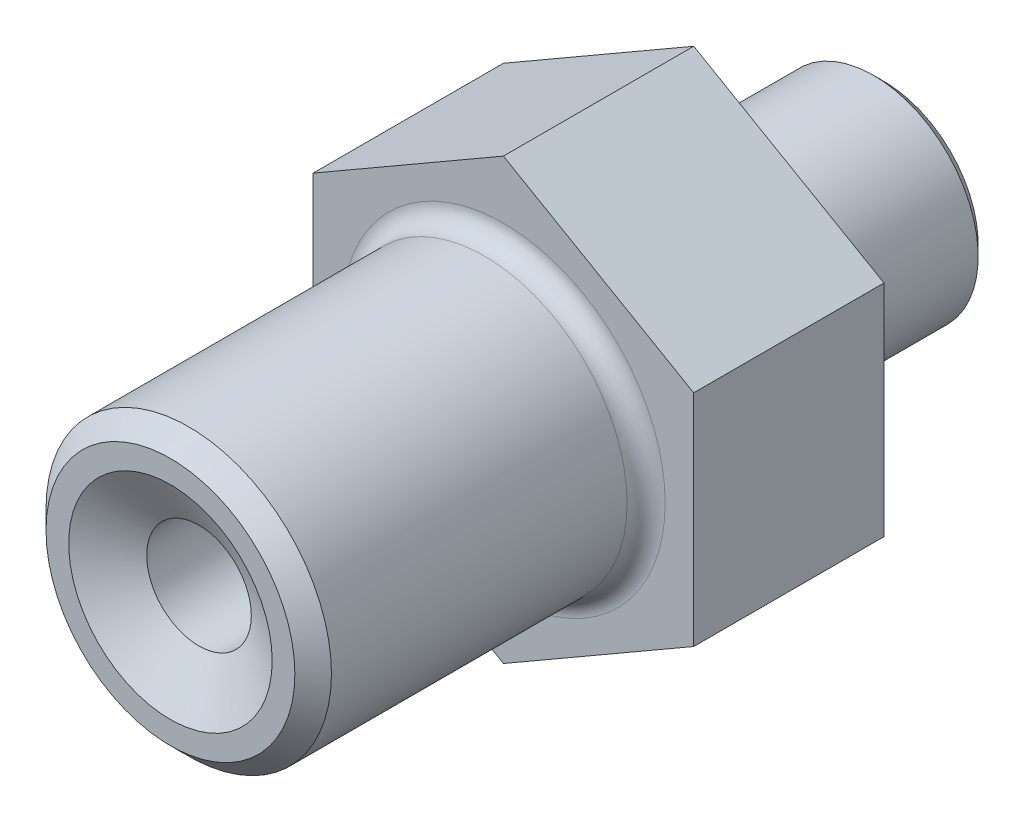
ISO-10303-21;
HEADER;
FILE_DESCRIPTION(('STEP AP214'),'2;1');
FILE_NAME('part.step','',(''),(''),'','','');
FILE_SCHEMA(('AUTOMOTIVE_DESIGN { 1 0 10303 214 1 1 1 1 }'));
ENDSEC;
DATA;
#1=APPLICATION_CONTEXT('core data for automotive mechanical design processes');
#2=APPLICATION_PROTOCOL_DEFINITION('international standard','automotive_design',2000,#1);
#3=PRODUCT_CONTEXT('',#1,'mechanical');
#4=PRODUCT('Part','Part','',(#3));
#5=PRODUCT_RELATED_PRODUCT_CATEGORY('part','',(#4));
#6=PRODUCT_DEFINITION_FORMATION('','',#4);
#7=PRODUCT_DEFINITION_CONTEXT('part definition',#1,'design');
#8=PRODUCT_DEFINITION('design','',#6,#7);
#9=PRODUCT_DEFINITION_SHAPE('','',#8);
#10=(LENGTH_UNIT() NAMED_UNIT(*) SI_UNIT(.MILLI.,.METRE.));
#11=(NAMED_UNIT(*) PLANE_ANGLE_UNIT() SI_UNIT($,.RADIAN.));
#12=(NAMED_UNIT(*) SI_UNIT($,.STERADIAN.) SOLID_ANGLE_UNIT());
#13=UNCERTAINTY_MEASURE_WITH_UNIT(LENGTH_MEASURE(1.E-05),#10,'distance_accuracy_value','');
#14=(GEOMETRIC_REPRESENTATION_CONTEXT(3) GLOBAL_UNCERTAINTY_ASSIGNED_CONTEXT((#13)) GLOBAL_UNIT_ASSIGNED_CONTEXT((#10,
#11,#12)) REPRESENTATION_CONTEXT('',''));
#15=CARTESIAN_POINT('',(0.,0.,0.));
#16=DIRECTION('',(0.,0.,1.));
#17=DIRECTION('',(1.,0.,0.));
#18=AXIS2_PLACEMENT_3D('',#15,#16,#17);
#19=CARTESIAN_POINT('',(0.,0.,55.));
#20=DIRECTION('',(0.,0.,1.));
#21=DIRECTION('',(1.00000000000002,0.,0.));
#22=AXIS2_PLACEMENT_3D('',#19,#20,#21);
#23=PLANE('',#22);
#24=CARTESIAN_POINT('',(0.,0.,55.));
#25=DIRECTION('',(0.,0.,1.));
#26=DIRECTION('',(1.00000000000002,0.,0.));
#27=AXIS2_PLACEMENT_3D('',#24,#25,#26);
#28=CIRCLE('',#27,13.079);
#29=CARTESIAN_POINT('',(13.0790000000002,0.,55.));
#30=VERTEX_POINT('',#29);
#31=EDGE_CURVE('E145',#30,#30,#28,.T.);
#32=ORIENTED_EDGE('',*,*,#31,.T.);
#33=EDGE_LOOP('',(#32));
#34=FACE_BOUND('',#33,.T.);
#35=CARTESIAN_POINT('',(0.,0.,55.));
#36=DIRECTION('',(0.,0.,1.));
#37=DIRECTION('',(1.00000000000002,0.,0.));
#38=AXIS2_PLACEMENT_3D('',#35,#36,#37);
#39=CIRCLE('',#38,10.6961524227067);
#40=CARTESIAN_POINT('',(10.6961524227068,0.,55.));
#41=VERTEX_POINT('',#40);
#42=EDGE_CURVE('E136',#41,#41,#39,.T.);
#43=ORIENTED_EDGE('',*,*,#42,.F.);
#44=EDGE_LOOP('',(#43));
#45=FACE_BOUND('',#44,.T.);
#46=ADVANCED_FACE('F38',(#34,#45),#23,.T.);
#47=CARTESIAN_POINT('',(0.,0.,-20.));
#48=DIRECTION('',(0.,0.,-1.));
#49=DIRECTION('',(-1.00000000000002,0.,0.));
#50=AXIS2_PLACEMENT_3D('',#47,#48,#49);
#51=PLANE('',#50);
#52=CARTESIAN_POINT('',(0.,0.,-20.));
#53=DIRECTION('',(0.,0.,-1.));
#54=DIRECTION('',(-1.00000000000002,0.,0.));
#55=AXIS2_PLACEMENT_3D('',#52,#53,#54);
#56=CIRCLE('',#55,6.65470053837926);
#57=CARTESIAN_POINT('',(-6.65470053837936,0.,-20.));
#58=VERTEX_POINT('',#57);
#59=EDGE_CURVE('E46',#58,#58,#56,.F.);
#60=ORIENTED_EDGE('',*,*,#59,.T.);
#61=EDGE_LOOP('',(#60));
#62=FACE_BOUND('',#61,.T.);
#63=CARTESIAN_POINT('',(0.,0.,-20.));
#64=DIRECTION('',(0.,0.,-1.));
#65=DIRECTION('',(-1.00000000000002,0.,0.));
#66=AXIS2_PLACEMENT_3D('',#63,#64,#65);
#67=CIRCLE('',#66,9.89849999999999);
#68=CARTESIAN_POINT('',(-9.89850000000014,0.,-20.));
#69=VERTEX_POINT('',#68);
#70=EDGE_CURVE('E139',#69,#69,#67,.T.);
#71=ORIENTED_EDGE('',*,*,#70,.T.);
#72=EDGE_LOOP('',(#71));
#73=FACE_BOUND('',#72,.T.);
#74=ADVANCED_FACE('F161',(#62,#73),#51,.T.);
#75=CARTESIAN_POINT('',(0.,0.,0.));
#76=DIRECTION('',(0.,0.,1.));
#77=DIRECTION('',(1.00000000000002,0.,0.));
#78=AXIS2_PLACEMENT_3D('',#75,#76,#77);
#79=PLANE('',#78);
#80=CARTESIAN_POINT('',(0.,0.,0.));
#81=DIRECTION('',(0.,0.,-1.));
#82=DIRECTION('',(-1.00000000000002,0.,0.));
#83=AXIS2_PLACEMENT_3D('',#80,#81,#82);
#84=CIRCLE('',#83,9.5);
#85=CARTESIAN_POINT('',(-9.50000000000014,0.,0.));
#86=VERTEX_POINT('',#85);
#87=EDGE_CURVE('E129',#86,#86,#84,.T.);
#88=ORIENTED_EDGE('',*,*,#87,.F.);
#89=EDGE_LOOP('',(#88));
#90=FACE_BOUND('',#89,.T.);
#91=DIRECTION('',(0.866025403784452,0.500000000000008,0.));
#92=VECTOR('',#91,1.);
#93=CARTESIAN_POINT('',(-20.0000000000003,11.5470053837927,0.));
#94=LINE('',#93,#92);
#95=CARTESIAN_POINT('',(-20.0000000000003,11.5470053837927,0.));
#96=VERTEX_POINT('',#95);
#97=CARTESIAN_POINT('',(0.,23.0940107675854,0.));
#98=VERTEX_POINT('',#97);
#99=EDGE_CURVE('E121',#96,#98,#94,.T.);
#100=ORIENTED_EDGE('',*,*,#99,.T.);
#101=DIRECTION('',(0.866025403784452,-0.500000000000008,0.));
#102=VECTOR('',#101,1.);
#103=CARTESIAN_POINT('',(0.,23.0940107675854,0.));
#104=LINE('',#103,#102);
#105=CARTESIAN_POINT('',(20.0000000000004,11.5470053837927,0.));
#106=VERTEX_POINT('',#105);
#107=EDGE_CURVE('E372',#98,#106,#104,.T.);
#108=ORIENTED_EDGE('',*,*,#107,.T.);
#109=DIRECTION('',(0.,-1.00000000000001,0.));
#110=VECTOR('',#109,1.);
#111=CARTESIAN_POINT('',(20.0000000000004,11.5470053837927,0.));
#112=LINE('',#111,#110);
#113=CARTESIAN_POINT('',(20.0000000000003,-11.5470053837926,0.));
#114=VERTEX_POINT('',#113);
#115=EDGE_CURVE('E386',#106,#114,#112,.T.);
#116=ORIENTED_EDGE('',*,*,#115,.T.);
#117=DIRECTION('',(-0.866025403784452,-0.500000000000007,0.));
#118=VECTOR('',#117,1.);
#119=CARTESIAN_POINT('',(20.0000000000003,-11.5470053837926,0.));
#120=LINE('',#119,#118);
#121=CARTESIAN_POINT('',(0.,-23.0940107675853,0.));
#122=VERTEX_POINT('',#121);
#123=EDGE_CURVE('E383',#114,#122,#120,.T.);
#124=ORIENTED_EDGE('',*,*,#123,.T.);
#125=DIRECTION('',(-0.866025403784452,0.500000000000008,0.));
#126=VECTOR('',#125,1.);
#127=CARTESIAN_POINT('',(0.,-23.0940107675853,0.));
#128=LINE('',#127,#126);
#129=CARTESIAN_POINT('',(-20.,-11.5470053837925,0.));
#130=VERTEX_POINT('',#129);
#131=EDGE_CURVE('E105',#122,#130,#128,.T.);
#132=ORIENTED_EDGE('',*,*,#131,.T.);
#133=DIRECTION('',(0.,1.00000000000001,0.));
#134=VECTOR('',#133,1.);
#135=CARTESIAN_POINT('',(-20.,-11.5470053837925,0.));
#136=LINE('',#135,#134);
#137=EDGE_CURVE('E132',#130,#96,#136,.T.);
#138=ORIENTED_EDGE('',*,*,#137,.T.);
#139=EDGE_LOOP('',(#100,#108,#116,#124,#132,#138));
#140=FACE_BOUND('',#139,.T.);
#141=ADVANCED_FACE('F184',(#90,#140),#79,.F.);
#142=CARTESIAN_POINT('',(0.,0.,20.));
#143=DIRECTION('',(0.,0.,1.));
#144=DIRECTION('',(1.00000000000002,0.,0.));
#145=AXIS2_PLACEMENT_3D('',#142,#143,#144);
#146=PLANE('',#145);
#147=CARTESIAN_POINT('',(0.,0.,20.));
#148=DIRECTION('',(0.,0.,1.));
#149=DIRECTION('',(1.00000000000002,0.,0.));
#150=AXIS2_PLACEMENT_3D('',#147,#148,#149);
#151=CIRCLE('',#150,17.);
#152=CARTESIAN_POINT('',(17.0000000000003,0.,20.));
#153=VERTEX_POINT('',#152);
#154=EDGE_CURVE('E156',#153,#153,#151,.F.);
#155=ORIENTED_EDGE('',*,*,#154,.T.);
#156=EDGE_LOOP('',(#155));
#157=FACE_BOUND('',#156,.T.);
#158=DIRECTION('',(0.866025403784452,0.500000000000008,0.));
#159=VECTOR('',#158,1.);
#160=CARTESIAN_POINT('',(-20.0000000000003,11.5470053837927,20.));
#161=LINE('',#160,#159);
#162=CARTESIAN_POINT('',(-20.0000000000003,11.5470053837927,20.));
#163=VERTEX_POINT('',#162);
#164=CARTESIAN_POINT('',(0.,23.0940107675853,20.));
#165=VERTEX_POINT('',#164);
#166=EDGE_CURVE('E124',#163,#165,#161,.T.);
#167=ORIENTED_EDGE('',*,*,#166,.F.);
#168=DIRECTION('',(0.,1.00000000000001,0.));
#169=VECTOR('',#168,1.);
#170=CARTESIAN_POINT('',(-20.0000000000003,-11.5470053837925,20.));
#171=LINE('',#170,#169);
#172=CARTESIAN_POINT('',(-20.0000000000003,-11.5470053837925,20.));
#173=VERTEX_POINT('',#172);
#174=EDGE_CURVE('E95',#173,#163,#171,.T.);
#175=ORIENTED_EDGE('',*,*,#174,.F.);
#176=DIRECTION('',(-0.866025403784452,0.500000000000007,0.));
#177=VECTOR('',#176,1.);
#178=CARTESIAN_POINT('',(0.,-23.0940107675853,20.));
#179=LINE('',#178,#177);
#180=CARTESIAN_POINT('',(0.,-23.0940107675853,20.));
#181=VERTEX_POINT('',#180);
#182=EDGE_CURVE('E88',#181,#173,#179,.T.);
#183=ORIENTED_EDGE('',*,*,#182,.F.);
#184=DIRECTION('',(-0.866025403784452,-0.500000000000007,0.));
#185=VECTOR('',#184,1.);
#186=CARTESIAN_POINT('',(20.0000000000003,-11.5470053837926,20.));
#187=LINE('',#186,#185);
#188=CARTESIAN_POINT('',(20.0000000000003,-11.5470053837926,20.));
#189=VERTEX_POINT('',#188);
#190=EDGE_CURVE('E92',#189,#181,#187,.T.);
#191=ORIENTED_EDGE('',*,*,#190,.F.);
#192=DIRECTION('',(0.,-1.00000000000001,0.));
#193=VECTOR('',#192,1.);
#194=CARTESIAN_POINT('',(20.0000000000003,11.5470053837927,20.));
#195=LINE('',#194,#193);
#196=CARTESIAN_POINT('',(20.0000000000003,11.5470053837927,20.));
#197=VERTEX_POINT('',#196);
#198=EDGE_CURVE('E59',#197,#189,#195,.T.);
#199=ORIENTED_EDGE('',*,*,#198,.F.);
#200=DIRECTION('',(0.866025403784452,-0.500000000000007,0.));
#201=VECTOR('',#200,1.);
#202=CARTESIAN_POINT('',(0.,23.0940107675853,20.));
#203=LINE('',#202,#201);
#204=EDGE_CURVE('E53',#165,#197,#203,.T.);
#205=ORIENTED_EDGE('',*,*,#204,.F.);
#206=EDGE_LOOP('',(#167,#175,#183,#191,#199,#205));
#207=FACE_BOUND('',#206,.T.);
#208=ADVANCED_FACE('F90',(#157,#207),#146,.T.);
#209=CARTESIAN_POINT('',(0.,0.,55.));
#210=DIRECTION('',(0.,0.,-1.));
#211=DIRECTION('',(-1.00000000000002,0.,0.));
#212=AXIS2_PLACEMENT_3D('',#209,#210,#211);
#213=CYLINDRICAL_SURFACE('',#212,15.);
#214=CARTESIAN_POINT('',(0.,0.,22.));
#215=DIRECTION('',(0.,0.,1.));
#216=DIRECTION('',(1.00000000000002,0.,0.));
#217=AXIS2_PLACEMENT_3D('',#214,#215,#216);
#218=CIRCLE('',#217,15.);
#219=CARTESIAN_POINT('',(15.0000000000002,0.,22.));
#220=VERTEX_POINT('',#219);
#221=EDGE_CURVE('E153',#220,#220,#218,.T.);
#222=ORIENTED_EDGE('',*,*,#221,.T.);
#223=EDGE_LOOP('',(#222));
#224=FACE_BOUND('',#223,.T.);
#225=CARTESIAN_POINT('',(0.,0.,53.079));
#226=DIRECTION('',(0.,0.,1.));
#227=DIRECTION('',(1.00000000000002,0.,0.));
#228=AXIS2_PLACEMENT_3D('',#225,#226,#227);
#229=CIRCLE('',#228,15.);
#230=CARTESIAN_POINT('',(15.0000000000002,0.,53.079));
#231=VERTEX_POINT('',#230);
#232=EDGE_CURVE('E150',#231,#231,#229,.F.);
#233=ORIENTED_EDGE('',*,*,#232,.T.);
#234=EDGE_LOOP('',(#233));
#235=FACE_BOUND('',#234,.T.);
#236=ADVANCED_FACE('F190',(#224,#235),#213,.T.);
#237=CARTESIAN_POINT('',(0.,0.,-20.));
#238=DIRECTION('',(0.,0.,1.));
#239=DIRECTION('',(1.00000000000002,0.,0.));
#240=AXIS2_PLACEMENT_3D('',#237,#238,#239);
#241=CYLINDRICAL_SURFACE('',#240,11.);
#242=CARTESIAN_POINT('',(0.,0.,-2.));
#243=DIRECTION('',(0.,0.,-1.));
#244=DIRECTION('',(-1.00000000000002,0.,0.));
#245=AXIS2_PLACEMENT_3D('',#242,#243,#244);
#246=CIRCLE('',#245,11.);
#247=CARTESIAN_POINT('',(-11.0000000000002,0.,-2.));
#248=VERTEX_POINT('',#247);
#249=EDGE_CURVE('E128',#248,#248,#246,.T.);
#250=ORIENTED_EDGE('',*,*,#249,.T.);
#251=EDGE_LOOP('',(#250));
#252=FACE_BOUND('',#251,.T.);
#253=CARTESIAN_POINT('',(0.,0.,-18.8985));
#254=DIRECTION('',(0.,0.,-1.));
#255=DIRECTION('',(-1.00000000000002,0.,0.));
#256=AXIS2_PLACEMENT_3D('',#253,#254,#255);
#257=CIRCLE('',#256,11.);
#258=CARTESIAN_POINT('',(-11.0000000000002,0.,-18.8985));
#259=VERTEX_POINT('',#258);
#260=EDGE_CURVE('E142',#259,#259,#257,.F.);
#261=ORIENTED_EDGE('',*,*,#260,.T.);
#262=EDGE_LOOP('',(#261));
#263=FACE_BOUND('',#262,.T.);
#264=ADVANCED_FACE('F189',(#252,#263),#241,.T.);
#265=CARTESIAN_POINT('',(0.,0.,52.));
#266=DIRECTION('',(0.,0.,1.));
#267=DIRECTION('',(1.00000000000002,0.,0.));
#268=AXIS2_PLACEMENT_3D('',#265,#266,#267);
#269=CONICAL_SURFACE('',#268,5.5,1.0471975511966);
#270=ORIENTED_EDGE('',*,*,#42,.T.);
#271=EDGE_LOOP('',(#270));
#272=FACE_BOUND('',#271,.T.);
#273=CARTESIAN_POINT('',(0.,0.,52.));
#274=DIRECTION('',(0.,0.,1.));
#275=DIRECTION('',(1.00000000000002,0.,0.));
#276=AXIS2_PLACEMENT_3D('',#273,#274,#275);
#277=CIRCLE('',#276,5.5);
#278=CARTESIAN_POINT('',(5.50000000000009,0.,52.));
#279=VERTEX_POINT('',#278);
#280=EDGE_CURVE('E133',#279,#279,#277,.T.);
#281=ORIENTED_EDGE('',*,*,#280,.F.);
#282=EDGE_LOOP('',(#281));
#283=FACE_BOUND('',#282,.T.);
#284=ADVANCED_FACE('F229',(#272,#283),#269,.F.);
#285=CARTESIAN_POINT('',(0.,0.,55.));
#286=DIRECTION('',(0.,0.,1.));
#287=DIRECTION('',(1.00000000000002,0.,0.));
#288=AXIS2_PLACEMENT_3D('',#285,#286,#287);
#289=CYLINDRICAL_SURFACE('',#288,5.5);
#290=CARTESIAN_POINT('',(0.,0.,-18.));
#291=DIRECTION('',(0.,0.,-1.));
#292=DIRECTION('',(-1.00000000000002,0.,0.));
#293=AXIS2_PLACEMENT_3D('',#290,#291,#292);
#294=CIRCLE('',#293,5.5);
#295=CARTESIAN_POINT('',(-5.50000000000008,0.,-18.));
#296=VERTEX_POINT('',#295);
#297=EDGE_CURVE('E11',#296,#296,#294,.T.);
#298=ORIENTED_EDGE('',*,*,#297,.T.);
#299=EDGE_LOOP('',(#298));
#300=FACE_BOUND('',#299,.T.);
#301=ORIENTED_EDGE('',*,*,#280,.T.);
#302=EDGE_LOOP('',(#301));
#303=FACE_BOUND('',#302,.T.);
#304=ADVANCED_FACE('F204',(#300,#303),#289,.F.);
#305=CARTESIAN_POINT('',(0.,0.,-20.));
#306=DIRECTION('',(0.,0.,1.));
#307=DIRECTION('',(1.00000000000002,0.,0.));
#308=AXIS2_PLACEMENT_3D('',#305,#306,#307);
#309=CONICAL_SURFACE('',#308,9.89849999999999,0.785398163397447);
#310=ORIENTED_EDGE('',*,*,#260,.F.);
#311=EDGE_LOOP('',(#310));
#312=FACE_BOUND('',#311,.T.);
#313=ORIENTED_EDGE('',*,*,#70,.F.);
#314=EDGE_LOOP('',(#313));
#315=FACE_BOUND('',#314,.T.);
#316=ADVANCED_FACE('F200',(#312,#315),#309,.T.);
#317=CARTESIAN_POINT('',(0.,0.,-2.));
#318=DIRECTION('',(0.,0.,-1.));
#319=DIRECTION('',(-1.00000000000002,0.,0.));
#320=AXIS2_PLACEMENT_3D('',#317,#318,#319);
#321=PLANE('',#320);
#322=CARTESIAN_POINT('',(0.,0.,-2.));
#323=DIRECTION('',(0.,0.,-1.));
#324=DIRECTION('',(-1.00000000000002,0.,0.));
#325=AXIS2_PLACEMENT_3D('',#322,#323,#324);
#326=CIRCLE('',#325,9.5);
#327=CARTESIAN_POINT('',(-9.50000000000014,0.,-2.));
#328=VERTEX_POINT('',#327);
#329=EDGE_CURVE('E125',#328,#328,#326,.T.);
#330=ORIENTED_EDGE('',*,*,#329,.T.);
#331=EDGE_LOOP('',(#330));
#332=FACE_BOUND('',#331,.T.);
#333=ORIENTED_EDGE('',*,*,#249,.F.);
#334=EDGE_LOOP('',(#333));
#335=FACE_BOUND('',#334,.T.);
#336=ADVANCED_FACE('F203',(#332,#335),#321,.F.);
#337=CARTESIAN_POINT('',(0.,0.,-2.));
#338=DIRECTION('',(0.,0.,1.));
#339=DIRECTION('',(1.00000000000002,0.,0.));
#340=AXIS2_PLACEMENT_3D('',#337,#338,#339);
#341=CYLINDRICAL_SURFACE('',#340,9.5);
#342=ORIENTED_EDGE('',*,*,#329,.F.);
#343=EDGE_LOOP('',(#342));
#344=FACE_BOUND('',#343,.T.);
#345=ORIENTED_EDGE('',*,*,#87,.T.);
#346=EDGE_LOOP('',(#345));
#347=FACE_BOUND('',#346,.T.);
#348=ADVANCED_FACE('F207',(#344,#347),#341,.T.);
#349=CARTESIAN_POINT('',(0.,0.,55.));
#350=DIRECTION('',(0.,0.,-1.));
#351=DIRECTION('',(-1.00000000000002,0.,0.));
#352=AXIS2_PLACEMENT_3D('',#349,#350,#351);
#353=CONICAL_SURFACE('',#352,13.079,0.785398163397447);
#354=ORIENTED_EDGE('',*,*,#232,.F.);
#355=EDGE_LOOP('',(#354));
#356=FACE_BOUND('',#355,.T.);
#357=ORIENTED_EDGE('',*,*,#31,.F.);
#358=EDGE_LOOP('',(#357));
#359=FACE_BOUND('',#358,.T.);
#360=ADVANCED_FACE('F175',(#356,#359),#353,.T.);
#361=CARTESIAN_POINT('',(0.,0.,22.));
#362=DIRECTION('',(0.,0.,1.));
#363=DIRECTION('',(1.00000000000002,0.,0.));
#364=AXIS2_PLACEMENT_3D('',#361,#362,#363);
#365=TOROIDAL_SURFACE('',#364,17.,2.);
#366=ORIENTED_EDGE('',*,*,#154,.F.);
#367=EDGE_LOOP('',(#366));
#368=FACE_BOUND('',#367,.T.);
#369=ORIENTED_EDGE('',*,*,#221,.F.);
#370=EDGE_LOOP('',(#369));
#371=FACE_BOUND('',#370,.T.);
#372=ADVANCED_FACE('F166',(#368,#371),#365,.F.);
#373=CARTESIAN_POINT('',(0.,0.,-20.));
#374=DIRECTION('',(0.,0.,-1.));
#375=DIRECTION('',(-1.00000000000002,0.,0.));
#376=AXIS2_PLACEMENT_3D('',#373,#374,#375);
#377=CONICAL_SURFACE('',#376,6.65470053837926,0.523598775598295);
#378=ORIENTED_EDGE('',*,*,#297,.F.);
#379=EDGE_LOOP('',(#378));
#380=FACE_BOUND('',#379,.T.);
#381=ORIENTED_EDGE('',*,*,#59,.F.);
#382=EDGE_LOOP('',(#381));
#383=FACE_BOUND('',#382,.T.);
#384=ADVANCED_FACE('F40',(#380,#383),#377,.F.);
#385=CARTESIAN_POINT('',(-20.0000000000003,11.5470053837927,81.1010092660779));
#386=DIRECTION('',(-0.500000000000008,0.866025403784452,0.));
#387=DIRECTION('',(-0.866025403784452,-0.500000000000008,0.));
#388=AXIS2_PLACEMENT_3D('',#385,#386,#387);
#389=PLANE('',#388);
#390=DIRECTION('',(0.,0.,-1.));
#391=VECTOR('',#390,1.);
#392=CARTESIAN_POINT('',(-20.0000000000003,11.5470053837927,81.1010092660779));
#393=LINE('',#392,#391);
#394=EDGE_CURVE('E99',#163,#96,#393,.T.);
#395=ORIENTED_EDGE('',*,*,#394,.F.);
#396=ORIENTED_EDGE('',*,*,#166,.T.);
#397=DIRECTION('',(0.,0.,-1.));
#398=VECTOR('',#397,1.);
#399=CARTESIAN_POINT('',(0.,23.0940107675854,81.1010092660779));
#400=LINE('',#399,#398);
#401=EDGE_CURVE('E122',#165,#98,#400,.T.);
#402=ORIENTED_EDGE('',*,*,#401,.T.);
#403=ORIENTED_EDGE('',*,*,#99,.F.);
#404=EDGE_LOOP('',(#395,#396,#402,#403));
#405=FACE_BOUND('',#404,.T.);
#406=ADVANCED_FACE('F165',(#405),#389,.T.);
#407=CARTESIAN_POINT('',(-20.,-11.5470053837925,81.1010092660779));
#408=DIRECTION('',(-1.00000000000001,0.,0.));
#409=DIRECTION('',(0.,-1.00000000000001,0.));
#410=AXIS2_PLACEMENT_3D('',#407,#408,#409);
#411=PLANE('',#410);
#412=DIRECTION('',(0.,0.,-1.));
#413=VECTOR('',#412,1.);
#414=CARTESIAN_POINT('',(-20.,-11.5470053837925,81.1010092660779));
#415=LINE('',#414,#413);
#416=EDGE_CURVE('E98',#173,#130,#415,.T.);
#417=ORIENTED_EDGE('',*,*,#416,.F.);
#418=ORIENTED_EDGE('',*,*,#174,.T.);
#419=ORIENTED_EDGE('',*,*,#394,.T.);
#420=ORIENTED_EDGE('',*,*,#137,.F.);
#421=EDGE_LOOP('',(#417,#418,#419,#420));
#422=FACE_BOUND('',#421,.T.);
#423=ADVANCED_FACE('F172',(#422),#411,.T.);
#424=CARTESIAN_POINT('',(0.,-23.0940107675852,81.1010092660779));
#425=DIRECTION('',(-0.500000000000007,-0.866025403784452,0.));
#426=DIRECTION('',(0.866025403784452,-0.500000000000007,0.));
#427=AXIS2_PLACEMENT_3D('',#424,#425,#426);
#428=PLANE('',#427);
#429=DIRECTION('',(0.,0.,-1.));
#430=VECTOR('',#429,1.);
#431=CARTESIAN_POINT('',(0.,-23.0940107675852,81.1010092660779));
#432=LINE('',#431,#430);
#433=EDGE_CURVE('E102',#181,#122,#432,.T.);
#434=ORIENTED_EDGE('',*,*,#433,.F.);
#435=ORIENTED_EDGE('',*,*,#182,.T.);
#436=ORIENTED_EDGE('',*,*,#416,.T.);
#437=ORIENTED_EDGE('',*,*,#131,.F.);
#438=EDGE_LOOP('',(#434,#435,#436,#437));
#439=FACE_BOUND('',#438,.T.);
#440=ADVANCED_FACE('F103',(#439),#428,.T.);
#441=CARTESIAN_POINT('',(20.0000000000003,-11.5470053837926,81.1010092660779));
#442=DIRECTION('',(0.500000000000007,-0.866025403784452,0.));
#443=DIRECTION('',(0.866025403784452,0.500000000000007,0.));
#444=AXIS2_PLACEMENT_3D('',#441,#442,#443);
#445=PLANE('',#444);
#446=DIRECTION('',(0.,0.,-1.));
#447=VECTOR('',#446,1.);
#448=CARTESIAN_POINT('',(20.0000000000003,-11.5470053837926,81.1010092660779));
#449=LINE('',#448,#447);
#450=EDGE_CURVE('E111',#189,#114,#449,.T.);
#451=ORIENTED_EDGE('',*,*,#450,.F.);
#452=ORIENTED_EDGE('',*,*,#190,.T.);
#453=ORIENTED_EDGE('',*,*,#433,.T.);
#454=ORIENTED_EDGE('',*,*,#123,.F.);
#455=EDGE_LOOP('',(#451,#452,#453,#454));
#456=FACE_BOUND('',#455,.T.);
#457=ADVANCED_FACE('F110',(#456),#445,.T.);
#458=CARTESIAN_POINT('',(20.0000000000005,11.5470053837927,81.1010092660779));
#459=DIRECTION('',(1.00000000000001,0.,0.));
#460=DIRECTION('',(0.,1.00000000000001,0.));
#461=AXIS2_PLACEMENT_3D('',#458,#459,#460);
#462=PLANE('',#461);
#463=DIRECTION('',(0.,0.,-1.));
#464=VECTOR('',#463,1.);
#465=CARTESIAN_POINT('',(20.0000000000005,11.5470053837927,81.1010092660779));
#466=LINE('',#465,#464);
#467=EDGE_CURVE('E119',#197,#106,#466,.T.);
#468=ORIENTED_EDGE('',*,*,#467,.F.);
#469=ORIENTED_EDGE('',*,*,#198,.T.);
#470=ORIENTED_EDGE('',*,*,#450,.T.);
#471=ORIENTED_EDGE('',*,*,#115,.F.);
#472=EDGE_LOOP('',(#468,#469,#470,#471));
#473=FACE_BOUND('',#472,.T.);
#474=ADVANCED_FACE('F346',(#473),#462,.T.);
#475=CARTESIAN_POINT('',(0.,23.0940107675854,81.1010092660779));
#476=DIRECTION('',(0.500000000000007,0.866025403784452,0.));
#477=DIRECTION('',(-0.866025403784452,0.500000000000007,0.));
#478=AXIS2_PLACEMENT_3D('',#475,#476,#477);
#479=PLANE('',#478);
#480=ORIENTED_EDGE('',*,*,#401,.F.);
#481=ORIENTED_EDGE('',*,*,#204,.T.);
#482=ORIENTED_EDGE('',*,*,#467,.T.);
#483=ORIENTED_EDGE('',*,*,#107,.F.);
#484=EDGE_LOOP('',(#480,#481,#482,#483));
#485=FACE_BOUND('',#484,.T.);
#486=ADVANCED_FACE('F355',(#485),#479,.T.);
#487=CLOSED_SHELL('',(#46,#74,#141,#208,#236,#264,#284,#304,#316,#336,#348,#360,#372,#384,#406,
#423,#440,#457,#474,#486));
#488=MANIFOLD_SOLID_BREP('B2',#487);
#489=ADVANCED_BREP_SHAPE_REPRESENTATION('',(#18,#488),#14);
#490=SHAPE_DEFINITION_REPRESENTATION(#9,#489);
ENDSEC;
END-ISO-10303-21;
